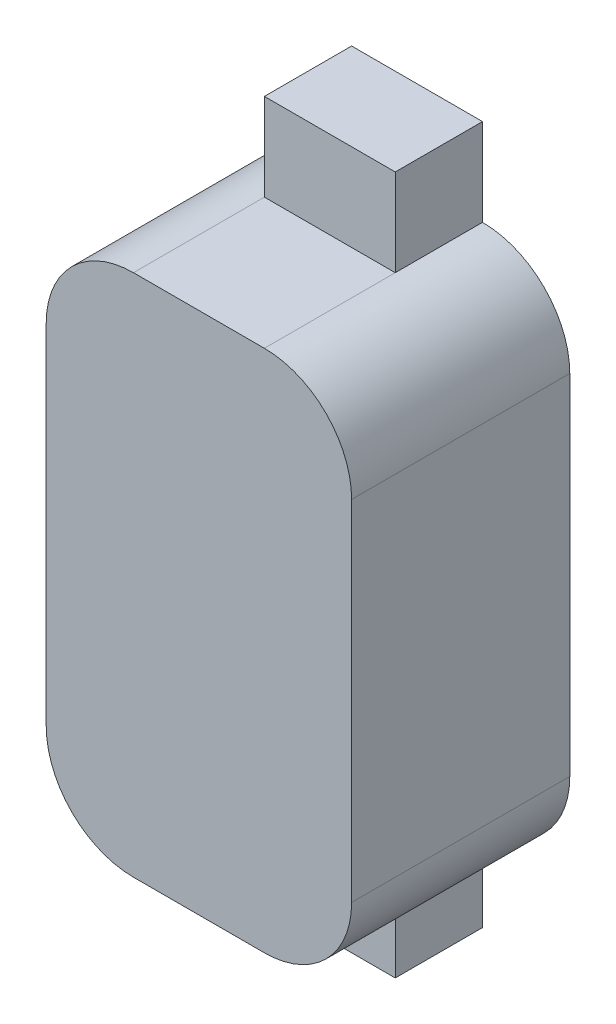
ISO-10303-21;
HEADER;
FILE_DESCRIPTION(('STEP AP214'),'2;1');
FILE_NAME('part.step','',(''),(''),'','','');
FILE_SCHEMA(('AUTOMOTIVE_DESIGN { 1 0 10303 214 1 1 1 1 }'));
ENDSEC;
DATA;
#1=APPLICATION_CONTEXT('core data for automotive mechanical design processes');
#2=APPLICATION_PROTOCOL_DEFINITION('international standard','automotive_design',2000,#1);
#3=PRODUCT_CONTEXT('',#1,'mechanical');
#4=PRODUCT('Part','Part','',(#3));
#5=PRODUCT_RELATED_PRODUCT_CATEGORY('part','',(#4));
#6=PRODUCT_DEFINITION_FORMATION('','',#4);
#7=PRODUCT_DEFINITION_CONTEXT('part definition',#1,'design');
#8=PRODUCT_DEFINITION('design','',#6,#7);
#9=PRODUCT_DEFINITION_SHAPE('','',#8);
#10=(LENGTH_UNIT() NAMED_UNIT(*) SI_UNIT(.MILLI.,.METRE.));
#11=(NAMED_UNIT(*) PLANE_ANGLE_UNIT() SI_UNIT($,.RADIAN.));
#12=(NAMED_UNIT(*) SI_UNIT($,.STERADIAN.) SOLID_ANGLE_UNIT());
#13=UNCERTAINTY_MEASURE_WITH_UNIT(LENGTH_MEASURE(1.E-05),#10,'distance_accuracy_value','');
#14=(GEOMETRIC_REPRESENTATION_CONTEXT(3) GLOBAL_UNCERTAINTY_ASSIGNED_CONTEXT((#13)) GLOBAL_UNIT_ASSIGNED_CONTEXT((#10,
#11,#12)) REPRESENTATION_CONTEXT('',''));
#15=CARTESIAN_POINT('',(0.,0.,0.));
#16=DIRECTION('',(0.,0.,1.));
#17=DIRECTION('',(1.,0.,0.));
#18=AXIS2_PLACEMENT_3D('',#15,#16,#17);
#19=CARTESIAN_POINT('',(0.749999999999999,2.,2.5));
#20=DIRECTION('',(0.,0.,-1.));
#21=DIRECTION('',(-1.,0.,0.));
#22=AXIS2_PLACEMENT_3D('',#19,#20,#21);
#23=CYLINDRICAL_SURFACE('',#22,1.);
#24=CARTESIAN_POINT('',(0.749999999999999,2.,0.));
#25=DIRECTION('',(0.,0.,1.));
#26=DIRECTION('',(1.,0.,0.));
#27=AXIS2_PLACEMENT_3D('',#24,#25,#26);
#28=CIRCLE('',#27,1.);
#29=CARTESIAN_POINT('',(0.749999999999992,3.,0.));
#30=VERTEX_POINT('',#29);
#31=CARTESIAN_POINT('',(1.75,1.99999999999999,0.));
#32=VERTEX_POINT('',#31);
#33=EDGE_CURVE('E259',#30,#32,#28,.F.);
#34=ORIENTED_EDGE('',*,*,#33,.F.);
#35=DIRECTION('',(0.,0.,-1.));
#36=VECTOR('',#35,1.);
#37=CARTESIAN_POINT('',(0.749999999999992,3.,1.));
#38=LINE('',#37,#36);
#39=CARTESIAN_POINT('',(0.749999999999992,3.,1.));
#40=VERTEX_POINT('',#39);
#41=EDGE_CURVE('E263',#40,#30,#38,.T.);
#42=ORIENTED_EDGE('',*,*,#41,.F.);
#43=DIRECTION('',(0.,0.,-1.));
#44=VECTOR('',#43,1.);
#45=CARTESIAN_POINT('',(0.749999999999992,3.,2.5));
#46=LINE('',#45,#44);
#47=CARTESIAN_POINT('',(0.749999999999992,3.,2.5));
#48=VERTEX_POINT('',#47);
#49=EDGE_CURVE('E210',#48,#40,#46,.T.);
#50=ORIENTED_EDGE('',*,*,#49,.F.);
#51=CARTESIAN_POINT('',(0.749999999999999,2.,2.5));
#52=DIRECTION('',(0.,0.,1.));
#53=DIRECTION('',(1.,0.,0.));
#54=AXIS2_PLACEMENT_3D('',#51,#52,#53);
#55=CIRCLE('',#54,1.);
#56=CARTESIAN_POINT('',(1.75,1.99999999999999,2.5));
#57=VERTEX_POINT('',#56);
#58=EDGE_CURVE('E245',#48,#57,#55,.F.);
#59=ORIENTED_EDGE('',*,*,#58,.T.);
#60=DIRECTION('',(0.,0.,-1.));
#61=VECTOR('',#60,1.);
#62=CARTESIAN_POINT('',(1.75,1.99999999999999,2.5));
#63=LINE('',#62,#61);
#64=EDGE_CURVE('E237',#57,#32,#63,.T.);
#65=ORIENTED_EDGE('',*,*,#64,.T.);
#66=EDGE_LOOP('',(#34,#42,#50,#59,#65));
#67=FACE_BOUND('',#66,.T.);
#68=ADVANCED_FACE('F43',(#67),#23,.T.);
#69=CARTESIAN_POINT('',(0.,3.,2.5));
#70=DIRECTION('',(0.,1.,0.));
#71=DIRECTION('',(0.,0.,1.));
#72=AXIS2_PLACEMENT_3D('',#69,#70,#71);
#73=PLANE('',#72);
#74=DIRECTION('',(1.,0.,0.));
#75=VECTOR('',#74,1.);
#76=CARTESIAN_POINT('',(0.,3.,1.));
#77=LINE('',#76,#75);
#78=CARTESIAN_POINT('',(-0.749999999999994,3.,1.));
#79=VERTEX_POINT('',#78);
#80=EDGE_CURVE('E306',#79,#40,#77,.T.);
#81=ORIENTED_EDGE('',*,*,#80,.F.);
#82=DIRECTION('',(0.,0.,-1.));
#83=VECTOR('',#82,1.);
#84=CARTESIAN_POINT('',(-0.749999999999994,3.,2.5));
#85=LINE('',#84,#83);
#86=CARTESIAN_POINT('',(-0.749999999999994,3.,2.5));
#87=VERTEX_POINT('',#86);
#88=EDGE_CURVE('E214',#87,#79,#85,.T.);
#89=ORIENTED_EDGE('',*,*,#88,.F.);
#90=DIRECTION('',(1.,0.,0.));
#91=VECTOR('',#90,1.);
#92=CARTESIAN_POINT('',(0.,3.,2.5));
#93=LINE('',#92,#91);
#94=EDGE_CURVE('E282',#87,#48,#93,.T.);
#95=ORIENTED_EDGE('',*,*,#94,.T.);
#96=ORIENTED_EDGE('',*,*,#49,.T.);
#97=EDGE_LOOP('',(#81,#89,#95,#96));
#98=FACE_BOUND('',#97,.T.);
#99=ADVANCED_FACE('F388',(#98),#73,.T.);
#100=CARTESIAN_POINT('',(-0.750000000000001,2.,2.5));
#101=DIRECTION('',(0.,0.,-1.));
#102=DIRECTION('',(-1.,0.,0.));
#103=AXIS2_PLACEMENT_3D('',#100,#101,#102);
#104=CYLINDRICAL_SURFACE('',#103,1.);
#105=CARTESIAN_POINT('',(-0.750000000000001,2.,0.));
#106=DIRECTION('',(0.,0.,1.));
#107=DIRECTION('',(1.,0.,0.));
#108=AXIS2_PLACEMENT_3D('',#105,#106,#107);
#109=CIRCLE('',#108,1.);
#110=CARTESIAN_POINT('',(-0.749999999999994,3.,0.));
#111=VERTEX_POINT('',#110);
#112=CARTESIAN_POINT('',(-1.75,1.99999999999999,0.));
#113=VERTEX_POINT('',#112);
#114=EDGE_CURVE('E256',#111,#113,#109,.T.);
#115=ORIENTED_EDGE('',*,*,#114,.T.);
#116=DIRECTION('',(0.,0.,-1.));
#117=VECTOR('',#116,1.);
#118=CARTESIAN_POINT('',(-1.75,1.99999999999999,2.5));
#119=LINE('',#118,#117);
#120=CARTESIAN_POINT('',(-1.75,1.99999999999999,2.5));
#121=VERTEX_POINT('',#120);
#122=EDGE_CURVE('E218',#121,#113,#119,.T.);
#123=ORIENTED_EDGE('',*,*,#122,.F.);
#124=CARTESIAN_POINT('',(-0.750000000000001,2.,2.5));
#125=DIRECTION('',(0.,0.,1.));
#126=DIRECTION('',(1.,0.,0.));
#127=AXIS2_PLACEMENT_3D('',#124,#125,#126);
#128=CIRCLE('',#127,1.);
#129=EDGE_CURVE('E279',#87,#121,#128,.T.);
#130=ORIENTED_EDGE('',*,*,#129,.F.);
#131=ORIENTED_EDGE('',*,*,#88,.T.);
#132=DIRECTION('',(0.,0.,-1.));
#133=VECTOR('',#132,1.);
#134=CARTESIAN_POINT('',(-0.749999999999994,3.,1.));
#135=LINE('',#134,#133);
#136=EDGE_CURVE('E297',#79,#111,#135,.T.);
#137=ORIENTED_EDGE('',*,*,#136,.T.);
#138=EDGE_LOOP('',(#115,#123,#130,#131,#137));
#139=FACE_BOUND('',#138,.T.);
#140=ADVANCED_FACE('F394',(#139),#104,.T.);
#141=CARTESIAN_POINT('',(-1.75,0.,2.5));
#142=DIRECTION('',(1.,0.,0.));
#143=DIRECTION('',(0.,1.,0.));
#144=AXIS2_PLACEMENT_3D('',#141,#142,#143);
#145=PLANE('',#144);
#146=DIRECTION('',(0.,-1.,0.));
#147=VECTOR('',#146,1.);
#148=CARTESIAN_POINT('',(-1.75,0.,0.));
#149=LINE('',#148,#147);
#150=CARTESIAN_POINT('',(-1.75,-1.99999999999999,0.));
#151=VERTEX_POINT('',#150);
#152=EDGE_CURVE('E253',#113,#151,#149,.T.);
#153=ORIENTED_EDGE('',*,*,#152,.T.);
#154=DIRECTION('',(0.,0.,-1.));
#155=VECTOR('',#154,1.);
#156=CARTESIAN_POINT('',(-1.75,-1.99999999999999,2.5));
#157=LINE('',#156,#155);
#158=CARTESIAN_POINT('',(-1.75,-1.99999999999999,2.5));
#159=VERTEX_POINT('',#158);
#160=EDGE_CURVE('E222',#159,#151,#157,.T.);
#161=ORIENTED_EDGE('',*,*,#160,.F.);
#162=DIRECTION('',(0.,-1.,0.));
#163=VECTOR('',#162,1.);
#164=CARTESIAN_POINT('',(-1.75,0.,2.5));
#165=LINE('',#164,#163);
#166=EDGE_CURVE('E276',#121,#159,#165,.T.);
#167=ORIENTED_EDGE('',*,*,#166,.F.);
#168=ORIENTED_EDGE('',*,*,#122,.T.);
#169=EDGE_LOOP('',(#153,#161,#167,#168));
#170=FACE_BOUND('',#169,.T.);
#171=ADVANCED_FACE('F566',(#170),#145,.F.);
#172=CARTESIAN_POINT('',(-0.750000000000001,-2.,2.5));
#173=DIRECTION('',(0.,0.,-1.));
#174=DIRECTION('',(-1.,0.,0.));
#175=AXIS2_PLACEMENT_3D('',#172,#173,#174);
#176=CYLINDRICAL_SURFACE('',#175,1.);
#177=CARTESIAN_POINT('',(-0.750000000000001,-2.,0.));
#178=DIRECTION('',(0.,0.,1.));
#179=DIRECTION('',(1.,0.,0.));
#180=AXIS2_PLACEMENT_3D('',#177,#178,#179);
#181=CIRCLE('',#180,1.);
#182=CARTESIAN_POINT('',(-0.749999999999993,-3.,0.));
#183=VERTEX_POINT('',#182);
#184=EDGE_CURVE('E250',#151,#183,#181,.T.);
#185=ORIENTED_EDGE('',*,*,#184,.T.);
#186=DIRECTION('',(0.,0.,-1.));
#187=VECTOR('',#186,1.);
#188=CARTESIAN_POINT('',(-0.749999999999993,-3.,1.));
#189=LINE('',#188,#187);
#190=CARTESIAN_POINT('',(-0.749999999999993,-3.,1.));
#191=VERTEX_POINT('',#190);
#192=EDGE_CURVE('E336',#191,#183,#189,.T.);
#193=ORIENTED_EDGE('',*,*,#192,.F.);
#194=DIRECTION('',(0.,0.,-1.));
#195=VECTOR('',#194,1.);
#196=CARTESIAN_POINT('',(-0.749999999999993,-3.,2.5));
#197=LINE('',#196,#195);
#198=CARTESIAN_POINT('',(-0.749999999999993,-3.,2.5));
#199=VERTEX_POINT('',#198);
#200=EDGE_CURVE('E226',#199,#191,#197,.T.);
#201=ORIENTED_EDGE('',*,*,#200,.F.);
#202=CARTESIAN_POINT('',(-0.750000000000001,-2.,2.5));
#203=DIRECTION('',(0.,0.,1.));
#204=DIRECTION('',(1.,0.,0.));
#205=AXIS2_PLACEMENT_3D('',#202,#203,#204);
#206=CIRCLE('',#205,1.);
#207=EDGE_CURVE('E273',#159,#199,#206,.T.);
#208=ORIENTED_EDGE('',*,*,#207,.F.);
#209=ORIENTED_EDGE('',*,*,#160,.T.);
#210=EDGE_LOOP('',(#185,#193,#201,#208,#209));
#211=FACE_BOUND('',#210,.T.);
#212=ADVANCED_FACE('F558',(#211),#176,.T.);
#213=CARTESIAN_POINT('',(0.,-3.,2.5));
#214=DIRECTION('',(0.,1.,0.));
#215=DIRECTION('',(0.,0.,1.));
#216=AXIS2_PLACEMENT_3D('',#213,#214,#215);
#217=PLANE('',#216);
#218=ORIENTED_EDGE('',*,*,#200,.T.);
#219=DIRECTION('',(1.,0.,0.));
#220=VECTOR('',#219,1.);
#221=CARTESIAN_POINT('',(0.,-3.,1.));
#222=LINE('',#221,#220);
#223=CARTESIAN_POINT('',(0.749999999999993,-3.,1.));
#224=VERTEX_POINT('',#223);
#225=EDGE_CURVE('E360',#191,#224,#222,.T.);
#226=ORIENTED_EDGE('',*,*,#225,.T.);
#227=DIRECTION('',(0.,0.,-1.));
#228=VECTOR('',#227,1.);
#229=CARTESIAN_POINT('',(0.749999999999993,-3.,2.5));
#230=LINE('',#229,#228);
#231=CARTESIAN_POINT('',(0.749999999999993,-3.,2.5));
#232=VERTEX_POINT('',#231);
#233=EDGE_CURVE('E230',#232,#224,#230,.T.);
#234=ORIENTED_EDGE('',*,*,#233,.F.);
#235=DIRECTION('',(1.,0.,0.));
#236=VECTOR('',#235,1.);
#237=CARTESIAN_POINT('',(0.,-3.,2.5));
#238=LINE('',#237,#236);
#239=EDGE_CURVE('E270',#199,#232,#238,.T.);
#240=ORIENTED_EDGE('',*,*,#239,.F.);
#241=EDGE_LOOP('',(#218,#226,#234,#240));
#242=FACE_BOUND('',#241,.T.);
#243=ADVANCED_FACE('F550',(#242),#217,.F.);
#244=CARTESIAN_POINT('',(0.75,-2.,2.5));
#245=DIRECTION('',(0.,0.,-1.));
#246=DIRECTION('',(-1.,0.,0.));
#247=AXIS2_PLACEMENT_3D('',#244,#245,#246);
#248=CYLINDRICAL_SURFACE('',#247,1.);
#249=CARTESIAN_POINT('',(0.75,-2.,0.));
#250=DIRECTION('',(0.,0.,1.));
#251=DIRECTION('',(1.,0.,0.));
#252=AXIS2_PLACEMENT_3D('',#249,#250,#251);
#253=CIRCLE('',#252,1.);
#254=CARTESIAN_POINT('',(0.749999999999993,-3.,0.));
#255=VERTEX_POINT('',#254);
#256=CARTESIAN_POINT('',(1.75,-1.99999999999999,0.));
#257=VERTEX_POINT('',#256);
#258=EDGE_CURVE('E246',#255,#257,#253,.T.);
#259=ORIENTED_EDGE('',*,*,#258,.T.);
#260=DIRECTION('',(0.,0.,-1.));
#261=VECTOR('',#260,1.);
#262=CARTESIAN_POINT('',(1.75,-1.99999999999999,2.5));
#263=LINE('',#262,#261);
#264=CARTESIAN_POINT('',(1.75,-1.99999999999999,2.5));
#265=VERTEX_POINT('',#264);
#266=EDGE_CURVE('E234',#265,#257,#263,.T.);
#267=ORIENTED_EDGE('',*,*,#266,.F.);
#268=CARTESIAN_POINT('',(0.75,-2.,2.5));
#269=DIRECTION('',(0.,0.,1.));
#270=DIRECTION('',(1.,0.,0.));
#271=AXIS2_PLACEMENT_3D('',#268,#269,#270);
#272=CIRCLE('',#271,1.);
#273=EDGE_CURVE('E267',#232,#265,#272,.T.);
#274=ORIENTED_EDGE('',*,*,#273,.F.);
#275=ORIENTED_EDGE('',*,*,#233,.T.);
#276=DIRECTION('',(0.,0.,-1.));
#277=VECTOR('',#276,1.);
#278=CARTESIAN_POINT('',(0.749999999999993,-3.,1.));
#279=LINE('',#278,#277);
#280=EDGE_CURVE('E332',#224,#255,#279,.T.);
#281=ORIENTED_EDGE('',*,*,#280,.T.);
#282=EDGE_LOOP('',(#259,#267,#274,#275,#281));
#283=FACE_BOUND('',#282,.T.);
#284=ADVANCED_FACE('F542',(#283),#248,.T.);
#285=CARTESIAN_POINT('',(1.75,0.,2.5));
#286=DIRECTION('',(1.,0.,0.));
#287=DIRECTION('',(0.,1.,0.));
#288=AXIS2_PLACEMENT_3D('',#285,#286,#287);
#289=PLANE('',#288);
#290=DIRECTION('',(0.,-1.,0.));
#291=VECTOR('',#290,1.);
#292=CARTESIAN_POINT('',(1.75,0.,0.));
#293=LINE('',#292,#291);
#294=EDGE_CURVE('E241',#32,#257,#293,.T.);
#295=ORIENTED_EDGE('',*,*,#294,.F.);
#296=ORIENTED_EDGE('',*,*,#64,.F.);
#297=DIRECTION('',(0.,-1.,0.));
#298=VECTOR('',#297,1.);
#299=CARTESIAN_POINT('',(1.75,0.,2.5));
#300=LINE('',#299,#298);
#301=EDGE_CURVE('E240',#57,#265,#300,.T.);
#302=ORIENTED_EDGE('',*,*,#301,.T.);
#303=ORIENTED_EDGE('',*,*,#266,.T.);
#304=EDGE_LOOP('',(#295,#296,#302,#303));
#305=FACE_BOUND('',#304,.T.);
#306=ADVANCED_FACE('F534',(#305),#289,.T.);
#307=CARTESIAN_POINT('',(0.,0.,2.5));
#308=DIRECTION('',(0.,0.,1.));
#309=DIRECTION('',(1.,0.,0.));
#310=AXIS2_PLACEMENT_3D('',#307,#308,#309);
#311=PLANE('',#310);
#312=ORIENTED_EDGE('',*,*,#58,.F.);
#313=ORIENTED_EDGE('',*,*,#94,.F.);
#314=ORIENTED_EDGE('',*,*,#129,.T.);
#315=ORIENTED_EDGE('',*,*,#166,.T.);
#316=ORIENTED_EDGE('',*,*,#207,.T.);
#317=ORIENTED_EDGE('',*,*,#239,.T.);
#318=ORIENTED_EDGE('',*,*,#273,.T.);
#319=ORIENTED_EDGE('',*,*,#301,.F.);
#320=EDGE_LOOP('',(#312,#313,#314,#315,#316,#317,#318,#319));
#321=FACE_BOUND('',#320,.T.);
#322=ADVANCED_FACE('F515',(#321),#311,.T.);
#323=CARTESIAN_POINT('',(0.,0.,0.));
#324=DIRECTION('',(0.,0.,1.));
#325=DIRECTION('',(1.,0.,0.));
#326=AXIS2_PLACEMENT_3D('',#323,#324,#325);
#327=PLANE('',#326);
#328=DIRECTION('',(1.,0.,0.));
#329=VECTOR('',#328,1.);
#330=CARTESIAN_POINT('',(0.,-2.,0.));
#331=LINE('',#330,#329);
#332=CARTESIAN_POINT('',(-1.,-2.,0.));
#333=VERTEX_POINT('',#332);
#334=CARTESIAN_POINT('',(1.,-2.,0.));
#335=VERTEX_POINT('',#334);
#336=EDGE_CURVE('E178',#333,#335,#331,.T.);
#337=ORIENTED_EDGE('',*,*,#336,.T.);
#338=DIRECTION('',(0.,-1.,0.));
#339=VECTOR('',#338,1.);
#340=CARTESIAN_POINT('',(1.,0.,0.));
#341=LINE('',#340,#339);
#342=CARTESIAN_POINT('',(0.999999999999999,2.,0.));
#343=VERTEX_POINT('',#342);
#344=EDGE_CURVE('E172',#343,#335,#341,.T.);
#345=ORIENTED_EDGE('',*,*,#344,.F.);
#346=DIRECTION('',(1.,0.,0.));
#347=VECTOR('',#346,1.);
#348=CARTESIAN_POINT('',(0.,2.,0.));
#349=LINE('',#348,#347);
#350=CARTESIAN_POINT('',(-1.,2.,0.));
#351=VERTEX_POINT('',#350);
#352=EDGE_CURVE('E176',#351,#343,#349,.T.);
#353=ORIENTED_EDGE('',*,*,#352,.F.);
#354=DIRECTION('',(0.,-1.,0.));
#355=VECTOR('',#354,1.);
#356=CARTESIAN_POINT('',(-1.,0.,0.));
#357=LINE('',#356,#355);
#358=EDGE_CURVE('E191',#351,#333,#357,.T.);
#359=ORIENTED_EDGE('',*,*,#358,.T.);
#360=EDGE_LOOP('',(#337,#345,#353,#359));
#361=FACE_BOUND('',#360,.T.);
#362=ORIENTED_EDGE('',*,*,#33,.T.);
#363=ORIENTED_EDGE('',*,*,#294,.T.);
#364=ORIENTED_EDGE('',*,*,#258,.F.);
#365=DIRECTION('',(0.,1.,0.));
#366=VECTOR('',#365,1.);
#367=CARTESIAN_POINT('',(0.749999999999993,0.,0.));
#368=LINE('',#367,#366);
#369=CARTESIAN_POINT('',(0.749999999999993,-4.,0.));
#370=VERTEX_POINT('',#369);
#371=EDGE_CURVE('E349',#370,#255,#368,.T.);
#372=ORIENTED_EDGE('',*,*,#371,.F.);
#373=DIRECTION('',(1.,0.,0.));
#374=VECTOR('',#373,1.);
#375=CARTESIAN_POINT('',(0.,-4.,0.));
#376=LINE('',#375,#374);
#377=CARTESIAN_POINT('',(-0.749999999999987,-4.,0.));
#378=VERTEX_POINT('',#377);
#379=EDGE_CURVE('E353',#378,#370,#376,.T.);
#380=ORIENTED_EDGE('',*,*,#379,.F.);
#381=DIRECTION('',(0.,1.,0.));
#382=VECTOR('',#381,1.);
#383=CARTESIAN_POINT('',(-0.750000000000013,0.,0.));
#384=LINE('',#383,#382);
#385=EDGE_CURVE('E344',#378,#183,#384,.T.);
#386=ORIENTED_EDGE('',*,*,#385,.T.);
#387=ORIENTED_EDGE('',*,*,#184,.F.);
#388=ORIENTED_EDGE('',*,*,#152,.F.);
#389=ORIENTED_EDGE('',*,*,#114,.F.);
#390=DIRECTION('',(0.,1.,0.));
#391=VECTOR('',#390,1.);
#392=CARTESIAN_POINT('',(-0.749999999999994,0.,0.));
#393=LINE('',#392,#391);
#394=CARTESIAN_POINT('',(-0.749999999999994,4.,0.));
#395=VERTEX_POINT('',#394);
#396=EDGE_CURVE('E302',#111,#395,#393,.T.);
#397=ORIENTED_EDGE('',*,*,#396,.T.);
#398=DIRECTION('',(1.,0.,0.));
#399=VECTOR('',#398,1.);
#400=CARTESIAN_POINT('',(0.,4.,0.));
#401=LINE('',#400,#399);
#402=CARTESIAN_POINT('',(0.749999999999985,4.,0.));
#403=VERTEX_POINT('',#402);
#404=EDGE_CURVE('E307',#395,#403,#401,.T.);
#405=ORIENTED_EDGE('',*,*,#404,.T.);
#406=DIRECTION('',(0.,1.,0.));
#407=VECTOR('',#406,1.);
#408=CARTESIAN_POINT('',(0.750000000000014,0.,0.));
#409=LINE('',#408,#407);
#410=EDGE_CURVE('E311',#30,#403,#409,.T.);
#411=ORIENTED_EDGE('',*,*,#410,.F.);
#412=EDGE_LOOP('',(#362,#363,#364,#372,#380,#386,#387,#388,#389,#397,#405,#411));
#413=FACE_BOUND('',#412,.T.);
#414=ADVANCED_FACE('F174',(#361,#413),#327,.F.);
#415=CARTESIAN_POINT('',(0.750000000000014,0.,1.));
#416=DIRECTION('',(-1.,0.,0.));
#417=DIRECTION('',(0.,-1.,0.));
#418=AXIS2_PLACEMENT_3D('',#415,#416,#417);
#419=PLANE('',#418);
#420=ORIENTED_EDGE('',*,*,#410,.T.);
#421=DIRECTION('',(0.,0.,-1.));
#422=VECTOR('',#421,1.);
#423=CARTESIAN_POINT('',(0.749999999999985,4.,1.));
#424=LINE('',#423,#422);
#425=CARTESIAN_POINT('',(0.749999999999985,4.,1.));
#426=VERTEX_POINT('',#425);
#427=EDGE_CURVE('E291',#426,#403,#424,.T.);
#428=ORIENTED_EDGE('',*,*,#427,.F.);
#429=DIRECTION('',(0.,1.,0.));
#430=VECTOR('',#429,1.);
#431=CARTESIAN_POINT('',(0.750000000000014,0.,1.));
#432=LINE('',#431,#430);
#433=EDGE_CURVE('E323',#40,#426,#432,.T.);
#434=ORIENTED_EDGE('',*,*,#433,.F.);
#435=ORIENTED_EDGE('',*,*,#41,.T.);
#436=EDGE_LOOP('',(#420,#428,#434,#435));
#437=FACE_BOUND('',#436,.T.);
#438=ADVANCED_FACE('F498',(#437),#419,.F.);
#439=CARTESIAN_POINT('',(0.,4.,1.));
#440=DIRECTION('',(0.,1.,0.));
#441=DIRECTION('',(0.,0.,1.));
#442=AXIS2_PLACEMENT_3D('',#439,#440,#441);
#443=PLANE('',#442);
#444=ORIENTED_EDGE('',*,*,#404,.F.);
#445=DIRECTION('',(0.,0.,-1.));
#446=VECTOR('',#445,1.);
#447=CARTESIAN_POINT('',(-0.749999999999994,4.,1.));
#448=LINE('',#447,#446);
#449=CARTESIAN_POINT('',(-0.749999999999994,4.,1.));
#450=VERTEX_POINT('',#449);
#451=EDGE_CURVE('E294',#450,#395,#448,.T.);
#452=ORIENTED_EDGE('',*,*,#451,.F.);
#453=DIRECTION('',(1.,0.,0.));
#454=VECTOR('',#453,1.);
#455=CARTESIAN_POINT('',(0.,4.,1.));
#456=LINE('',#455,#454);
#457=EDGE_CURVE('E319',#450,#426,#456,.T.);
#458=ORIENTED_EDGE('',*,*,#457,.T.);
#459=ORIENTED_EDGE('',*,*,#427,.T.);
#460=EDGE_LOOP('',(#444,#452,#458,#459));
#461=FACE_BOUND('',#460,.T.);
#462=ADVANCED_FACE('F489',(#461),#443,.T.);
#463=CARTESIAN_POINT('',(-0.749999999999994,0.,1.));
#464=DIRECTION('',(-1.,0.,0.));
#465=DIRECTION('',(0.,0.,1.));
#466=AXIS2_PLACEMENT_3D('',#463,#464,#465);
#467=PLANE('',#466);
#468=ORIENTED_EDGE('',*,*,#396,.F.);
#469=ORIENTED_EDGE('',*,*,#136,.F.);
#470=DIRECTION('',(0.,1.,0.));
#471=VECTOR('',#470,1.);
#472=CARTESIAN_POINT('',(-0.749999999999994,0.,1.));
#473=LINE('',#472,#471);
#474=EDGE_CURVE('E301',#79,#450,#473,.T.);
#475=ORIENTED_EDGE('',*,*,#474,.T.);
#476=ORIENTED_EDGE('',*,*,#451,.T.);
#477=EDGE_LOOP('',(#468,#469,#475,#476));
#478=FACE_BOUND('',#477,.T.);
#479=ADVANCED_FACE('F480',(#478),#467,.T.);
#480=CARTESIAN_POINT('',(0.,0.,1.));
#481=DIRECTION('',(0.,0.,1.));
#482=DIRECTION('',(1.,0.,0.));
#483=AXIS2_PLACEMENT_3D('',#480,#481,#482);
#484=PLANE('',#483);
#485=ORIENTED_EDGE('',*,*,#80,.T.);
#486=ORIENTED_EDGE('',*,*,#433,.T.);
#487=ORIENTED_EDGE('',*,*,#457,.F.);
#488=ORIENTED_EDGE('',*,*,#474,.F.);
#489=EDGE_LOOP('',(#485,#486,#487,#488));
#490=FACE_BOUND('',#489,.T.);
#491=ADVANCED_FACE('F471',(#490),#484,.T.);
#492=CARTESIAN_POINT('',(0.,-4.,1.));
#493=DIRECTION('',(0.,1.,0.));
#494=DIRECTION('',(0.,0.,1.));
#495=AXIS2_PLACEMENT_3D('',#492,#493,#494);
#496=PLANE('',#495);
#497=ORIENTED_EDGE('',*,*,#379,.T.);
#498=DIRECTION('',(0.,0.,-1.));
#499=VECTOR('',#498,1.);
#500=CARTESIAN_POINT('',(0.749999999999993,-4.,1.));
#501=LINE('',#500,#499);
#502=CARTESIAN_POINT('',(0.749999999999993,-4.,1.));
#503=VERTEX_POINT('',#502);
#504=EDGE_CURVE('E315',#503,#370,#501,.T.);
#505=ORIENTED_EDGE('',*,*,#504,.F.);
#506=DIRECTION('',(1.,0.,0.));
#507=VECTOR('',#506,1.);
#508=CARTESIAN_POINT('',(0.,-4.,1.));
#509=LINE('',#508,#507);
#510=CARTESIAN_POINT('',(-0.749999999999987,-4.,1.));
#511=VERTEX_POINT('',#510);
#512=EDGE_CURVE('E348',#511,#503,#509,.T.);
#513=ORIENTED_EDGE('',*,*,#512,.F.);
#514=DIRECTION('',(0.,0.,-1.));
#515=VECTOR('',#514,1.);
#516=CARTESIAN_POINT('',(-0.749999999999987,-4.,1.));
#517=LINE('',#516,#515);
#518=EDGE_CURVE('E340',#511,#378,#517,.T.);
#519=ORIENTED_EDGE('',*,*,#518,.T.);
#520=EDGE_LOOP('',(#497,#505,#513,#519));
#521=FACE_BOUND('',#520,.T.);
#522=ADVANCED_FACE('F462',(#521),#496,.F.);
#523=CARTESIAN_POINT('',(0.749999999999993,0.,1.));
#524=DIRECTION('',(-1.,0.,0.));
#525=DIRECTION('',(0.,0.,1.));
#526=AXIS2_PLACEMENT_3D('',#523,#524,#525);
#527=PLANE('',#526);
#528=ORIENTED_EDGE('',*,*,#371,.T.);
#529=ORIENTED_EDGE('',*,*,#280,.F.);
#530=DIRECTION('',(0.,1.,0.));
#531=VECTOR('',#530,1.);
#532=CARTESIAN_POINT('',(0.749999999999993,0.,1.));
#533=LINE('',#532,#531);
#534=EDGE_CURVE('E363',#503,#224,#533,.T.);
#535=ORIENTED_EDGE('',*,*,#534,.F.);
#536=ORIENTED_EDGE('',*,*,#504,.T.);
#537=EDGE_LOOP('',(#528,#529,#535,#536));
#538=FACE_BOUND('',#537,.T.);
#539=ADVANCED_FACE('F453',(#538),#527,.F.);
#540=CARTESIAN_POINT('',(-0.750000000000013,0.,1.));
#541=DIRECTION('',(-1.,0.,0.));
#542=DIRECTION('',(0.,-1.,0.));
#543=AXIS2_PLACEMENT_3D('',#540,#541,#542);
#544=PLANE('',#543);
#545=ORIENTED_EDGE('',*,*,#385,.F.);
#546=ORIENTED_EDGE('',*,*,#518,.F.);
#547=DIRECTION('',(0.,1.,0.));
#548=VECTOR('',#547,1.);
#549=CARTESIAN_POINT('',(-0.750000000000013,0.,1.));
#550=LINE('',#549,#548);
#551=EDGE_CURVE('E343',#511,#191,#550,.T.);
#552=ORIENTED_EDGE('',*,*,#551,.T.);
#553=ORIENTED_EDGE('',*,*,#192,.T.);
#554=EDGE_LOOP('',(#545,#546,#552,#553));
#555=FACE_BOUND('',#554,.T.);
#556=ADVANCED_FACE('F384',(#555),#544,.T.);
#557=CARTESIAN_POINT('',(0.,0.,1.));
#558=DIRECTION('',(0.,0.,1.));
#559=DIRECTION('',(1.,0.,0.));
#560=AXIS2_PLACEMENT_3D('',#557,#558,#559);
#561=PLANE('',#560);
#562=ORIENTED_EDGE('',*,*,#512,.T.);
#563=ORIENTED_EDGE('',*,*,#534,.T.);
#564=ORIENTED_EDGE('',*,*,#225,.F.);
#565=ORIENTED_EDGE('',*,*,#551,.F.);
#566=EDGE_LOOP('',(#562,#563,#564,#565));
#567=FACE_BOUND('',#566,.T.);
#568=ADVANCED_FACE('F378',(#567),#561,.T.);
#569=CARTESIAN_POINT('',(0.,0.,0.7));
#570=DIRECTION('',(0.,0.,1.));
#571=DIRECTION('',(1.,0.,0.));
#572=AXIS2_PLACEMENT_3D('',#569,#570,#571);
#573=PLANE('',#572);
#574=DIRECTION('',(0.,-1.,0.));
#575=VECTOR('',#574,1.);
#576=CARTESIAN_POINT('',(0.509854723253201,-2.,0.7));
#577=LINE('',#576,#575);
#578=CARTESIAN_POINT('',(0.5098547232532,1.5098547232532,0.7));
#579=VERTEX_POINT('',#578);
#580=CARTESIAN_POINT('',(0.509854723253201,-1.5098547232532,0.7));
#581=VERTEX_POINT('',#580);
#582=EDGE_CURVE('E194',#579,#581,#577,.T.);
#583=ORIENTED_EDGE('',*,*,#582,.T.);
#584=DIRECTION('',(-1.,0.,0.));
#585=VECTOR('',#584,1.);
#586=CARTESIAN_POINT('',(0.,-1.5098547232532,0.7));
#587=LINE('',#586,#585);
#588=CARTESIAN_POINT('',(-0.509854723253201,-1.5098547232532,0.7));
#589=VERTEX_POINT('',#588);
#590=EDGE_CURVE('E11',#581,#589,#587,.T.);
#591=ORIENTED_EDGE('',*,*,#590,.T.);
#592=DIRECTION('',(0.,1.,0.));
#593=VECTOR('',#592,1.);
#594=CARTESIAN_POINT('',(-0.509854723253201,0.,0.7));
#595=LINE('',#594,#593);
#596=CARTESIAN_POINT('',(-0.509854723253202,1.5098547232532,0.7));
#597=VERTEX_POINT('',#596);
#598=EDGE_CURVE('E54',#589,#597,#595,.T.);
#599=ORIENTED_EDGE('',*,*,#598,.T.);
#600=DIRECTION('',(1.,0.,0.));
#601=VECTOR('',#600,1.);
#602=CARTESIAN_POINT('',(0.999999999999999,1.5098547232532,0.7));
#603=LINE('',#602,#601);
#604=EDGE_CURVE('E205',#597,#579,#603,.T.);
#605=ORIENTED_EDGE('',*,*,#604,.T.);
#606=EDGE_LOOP('',(#583,#591,#599,#605));
#607=FACE_BOUND('',#606,.T.);
#608=ADVANCED_FACE('F376',(#607),#573,.F.);
#609=CARTESIAN_POINT('',(0.,1.5098547232532,0.7));
#610=DIRECTION('',(0.,-0.819152044288989,-0.57357643635105));
#611=DIRECTION('',(-1.,0.,0.));
#612=AXIS2_PLACEMENT_3D('',#609,#610,#611);
#613=PLANE('',#612);
#614=DIRECTION('',(0.497542812164526,0.497542812164526,-0.710564775461626));
#615=VECTOR('',#614,1.);
#616=CARTESIAN_POINT('',(0.383640772877135,1.38364077287714,0.880252201652624));
#617=LINE('',#616,#615);
#618=EDGE_CURVE('E186',#579,#343,#617,.T.);
#619=ORIENTED_EDGE('',*,*,#618,.F.);
#620=ORIENTED_EDGE('',*,*,#604,.F.);
#621=DIRECTION('',(0.497542812164526,-0.497542812164526,0.710564775461626));
#622=VECTOR('',#621,1.);
#623=CARTESIAN_POINT('',(-0.504902300126831,1.50490230012683,0.707072793216469));
#624=LINE('',#623,#622);
#625=EDGE_CURVE('E48',#351,#597,#624,.T.);
#626=ORIENTED_EDGE('',*,*,#625,.F.);
#627=ORIENTED_EDGE('',*,*,#352,.T.);
#628=EDGE_LOOP('',(#619,#620,#626,#627));
#629=FACE_BOUND('',#628,.T.);
#630=ADVANCED_FACE('F46',(#629),#613,.T.);
#631=CARTESIAN_POINT('',(-1.,0.,0.));
#632=DIRECTION('',(-0.819152044288989,0.,0.57357643635105));
#633=DIRECTION('',(0.,-1.,0.));
#634=AXIS2_PLACEMENT_3D('',#631,#632,#633);
#635=PLANE('',#634);
#636=ORIENTED_EDGE('',*,*,#625,.T.);
#637=ORIENTED_EDGE('',*,*,#598,.F.);
#638=DIRECTION('',(-0.497542812164526,-0.497542812164526,-0.710564775461626));
#639=VECTOR('',#638,1.);
#640=CARTESIAN_POINT('',(-0.752451150063416,-1.75245115006341,0.353536396608236));
#641=LINE('',#640,#639);
#642=EDGE_CURVE('E62',#333,#589,#641,.F.);
#643=ORIENTED_EDGE('',*,*,#642,.F.);
#644=ORIENTED_EDGE('',*,*,#358,.F.);
#645=EDGE_LOOP('',(#636,#637,#643,#644));
#646=FACE_BOUND('',#645,.T.);
#647=ADVANCED_FACE('F374',(#646),#635,.F.);
#648=CARTESIAN_POINT('',(0.5098547232532,0.,0.7));
#649=DIRECTION('',(-0.819152044288989,0.,-0.57357643635105));
#650=DIRECTION('',(0.,1.,0.));
#651=AXIS2_PLACEMENT_3D('',#648,#649,#650);
#652=PLANE('',#651);
#653=ORIENTED_EDGE('',*,*,#618,.T.);
#654=ORIENTED_EDGE('',*,*,#344,.T.);
#655=DIRECTION('',(0.497542812164526,-0.497542812164526,-0.710564775461626));
#656=VECTOR('',#655,1.);
#657=CARTESIAN_POINT('',(0.752451150063415,-1.75245115006341,0.353536396608236));
#658=LINE('',#657,#656);
#659=EDGE_CURVE('E198',#581,#335,#658,.T.);
#660=ORIENTED_EDGE('',*,*,#659,.F.);
#661=ORIENTED_EDGE('',*,*,#582,.F.);
#662=EDGE_LOOP('',(#653,#654,#660,#661));
#663=FACE_BOUND('',#662,.T.);
#664=ADVANCED_FACE('F193',(#663),#652,.T.);
#665=CARTESIAN_POINT('',(0.,-2.,0.));
#666=DIRECTION('',(0.,-0.819152044288989,0.57357643635105));
#667=DIRECTION('',(1.,0.,0.));
#668=AXIS2_PLACEMENT_3D('',#665,#666,#667);
#669=PLANE('',#668);
#670=ORIENTED_EDGE('',*,*,#642,.T.);
#671=ORIENTED_EDGE('',*,*,#590,.F.);
#672=ORIENTED_EDGE('',*,*,#659,.T.);
#673=ORIENTED_EDGE('',*,*,#336,.F.);
#674=EDGE_LOOP('',(#670,#671,#672,#673));
#675=FACE_BOUND('',#674,.T.);
#676=ADVANCED_FACE('F375',(#675),#669,.F.);
#677=CLOSED_SHELL('',(#68,#99,#140,#171,#212,#243,#284,#306,#322,#414,#438,#462,#479,#491,#522,
#539,#556,#568,#608,#630,#647,#664,#676));
#678=MANIFOLD_SOLID_BREP('B2',#677);
#679=ADVANCED_BREP_SHAPE_REPRESENTATION('',(#18,#678),#14);
#680=SHAPE_DEFINITION_REPRESENTATION(#9,#679);
ENDSEC;
END-ISO-10303-21;
